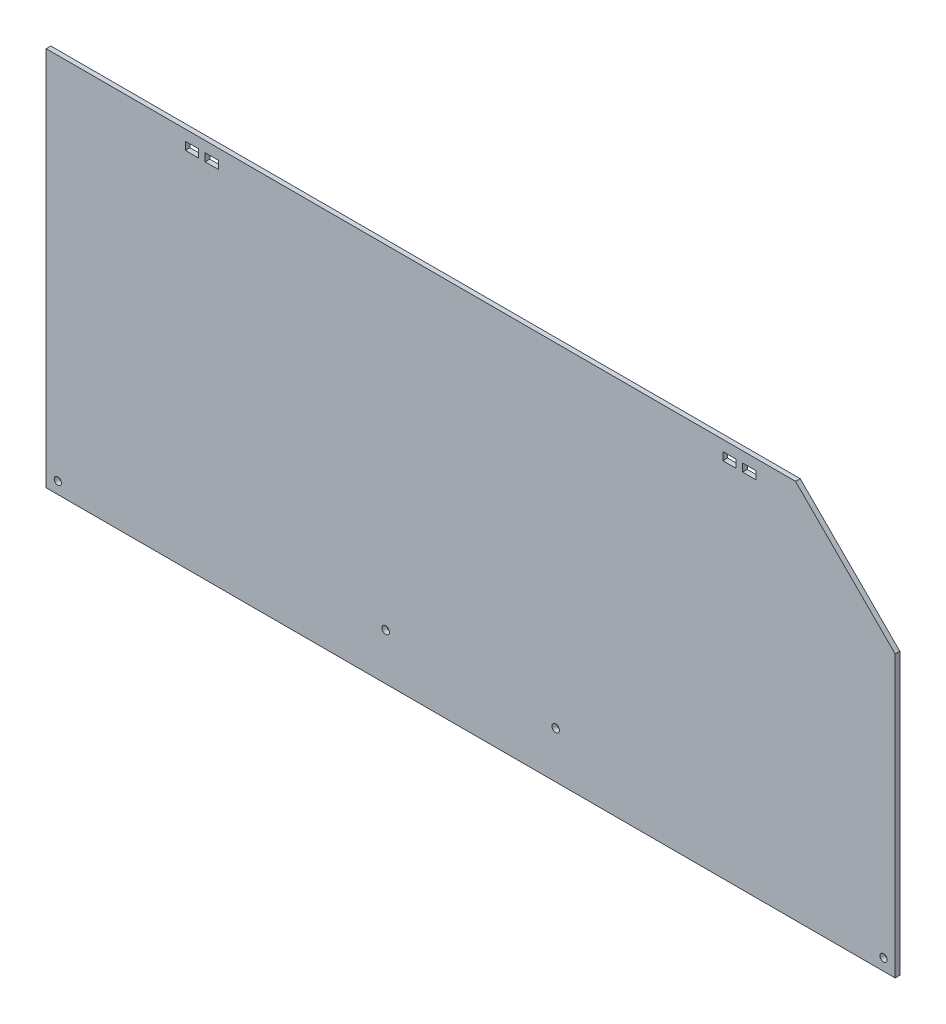
ISO-10303-21;
HEADER;
FILE_DESCRIPTION(('STEP AP214'),'2;1');
FILE_NAME('part.step','',(''),(''),'','','');
FILE_SCHEMA(('AUTOMOTIVE_DESIGN { 1 0 10303 214 1 1 1 1 }'));
ENDSEC;
DATA;
#1=APPLICATION_CONTEXT('core data for automotive mechanical design processes');
#2=APPLICATION_PROTOCOL_DEFINITION('international standard','automotive_design',2000,#1);
#3=PRODUCT_CONTEXT('',#1,'mechanical');
#4=PRODUCT('Part','Part','',(#3));
#5=PRODUCT_RELATED_PRODUCT_CATEGORY('part','',(#4));
#6=PRODUCT_DEFINITION_FORMATION('','',#4);
#7=PRODUCT_DEFINITION_CONTEXT('part definition',#1,'design');
#8=PRODUCT_DEFINITION('design','',#6,#7);
#9=PRODUCT_DEFINITION_SHAPE('','',#8);
#10=(LENGTH_UNIT() NAMED_UNIT(*) SI_UNIT(.MILLI.,.METRE.));
#11=(NAMED_UNIT(*) PLANE_ANGLE_UNIT() SI_UNIT($,.RADIAN.));
#12=(NAMED_UNIT(*) SI_UNIT($,.STERADIAN.) SOLID_ANGLE_UNIT());
#13=UNCERTAINTY_MEASURE_WITH_UNIT(LENGTH_MEASURE(1.E-05),#10,'distance_accuracy_value','');
#14=(GEOMETRIC_REPRESENTATION_CONTEXT(3) GLOBAL_UNCERTAINTY_ASSIGNED_CONTEXT((#13)) GLOBAL_UNIT_ASSIGNED_CONTEXT((#10,
#11,#12)) REPRESENTATION_CONTEXT('',''));
#15=CARTESIAN_POINT('',(0.,0.,0.));
#16=DIRECTION('',(0.,0.,1.));
#17=DIRECTION('',(1.,0.,0.));
#18=AXIS2_PLACEMENT_3D('',#15,#16,#17);
#19=CARTESIAN_POINT('',(-669.5,-329.5,4.));
#20=DIRECTION('',(1.,0.,0.));
#21=DIRECTION('',(0.,0.,-1.));
#22=AXIS2_PLACEMENT_3D('',#19,#20,#21);
#23=PLANE('',#22);
#24=DIRECTION('',(0.,1.,0.));
#25=VECTOR('',#24,1.);
#26=CARTESIAN_POINT('',(-669.5,-329.5,0.));
#27=LINE('',#26,#25);
#28=CARTESIAN_POINT('',(-669.5,-329.5,0.));
#29=VERTEX_POINT('',#28);
#30=CARTESIAN_POINT('',(-669.5,-2.94999999999981,0.));
#31=VERTEX_POINT('',#30);
#32=EDGE_CURVE('E234',#29,#31,#27,.T.);
#33=ORIENTED_EDGE('',*,*,#32,.F.);
#34=DIRECTION('',(0.,0.,-1.));
#35=VECTOR('',#34,1.);
#36=CARTESIAN_POINT('',(-669.5,-329.5,4.));
#37=LINE('',#36,#35);
#38=CARTESIAN_POINT('',(-669.5,-329.5,4.));
#39=VERTEX_POINT('',#38);
#40=EDGE_CURVE('E389',#39,#29,#37,.T.);
#41=ORIENTED_EDGE('',*,*,#40,.F.);
#42=DIRECTION('',(0.,1.,0.));
#43=VECTOR('',#42,1.);
#44=CARTESIAN_POINT('',(-669.5,-329.5,4.));
#45=LINE('',#44,#43);
#46=CARTESIAN_POINT('',(-669.5,-2.94999999999981,4.));
#47=VERTEX_POINT('',#46);
#48=EDGE_CURVE('E369',#39,#47,#45,.T.);
#49=ORIENTED_EDGE('',*,*,#48,.T.);
#50=DIRECTION('',(0.,0.,-1.));
#51=VECTOR('',#50,1.);
#52=CARTESIAN_POINT('',(-669.5,-2.94999999999981,4.));
#53=LINE('',#52,#51);
#54=EDGE_CURVE('E11',#47,#31,#53,.T.);
#55=ORIENTED_EDGE('',*,*,#54,.T.);
#56=EDGE_LOOP('',(#33,#41,#49,#55));
#57=FACE_BOUND('',#56,.T.);
#58=ADVANCED_FACE('F38',(#57),#23,.F.);
#59=CARTESIAN_POINT('',(-669.5,-2.94999999999981,4.));
#60=DIRECTION('',(0.,-1.,0.));
#61=DIRECTION('',(-1.,0.,0.));
#62=AXIS2_PLACEMENT_3D('',#59,#60,#61);
#63=PLANE('',#62);
#64=DIRECTION('',(1.,0.,0.));
#65=VECTOR('',#64,1.);
#66=CARTESIAN_POINT('',(-669.5,-2.94999999999981,0.));
#67=LINE('',#66,#65);
#68=CARTESIAN_POINT('',(-26.0413780286484,-2.94999999999995,0.));
#69=VERTEX_POINT('',#68);
#70=EDGE_CURVE('E393',#31,#69,#67,.T.);
#71=ORIENTED_EDGE('',*,*,#70,.F.);
#72=ORIENTED_EDGE('',*,*,#54,.F.);
#73=DIRECTION('',(1.,0.,0.));
#74=VECTOR('',#73,1.);
#75=CARTESIAN_POINT('',(-669.5,-2.94999999999981,4.));
#76=LINE('',#75,#74);
#77=CARTESIAN_POINT('',(-26.0413780286484,-2.94999999999995,4.));
#78=VERTEX_POINT('',#77);
#79=EDGE_CURVE('E373',#47,#78,#76,.T.);
#80=ORIENTED_EDGE('',*,*,#79,.T.);
#81=DIRECTION('',(0.,0.,-1.));
#82=VECTOR('',#81,1.);
#83=CARTESIAN_POINT('',(-26.0413780286484,-2.94999999999995,4.));
#84=LINE('',#83,#82);
#85=EDGE_CURVE('E46',#78,#69,#84,.T.);
#86=ORIENTED_EDGE('',*,*,#85,.T.);
#87=EDGE_LOOP('',(#71,#72,#80,#86));
#88=FACE_BOUND('',#87,.T.);
#89=ADVANCED_FACE('F421',(#88),#63,.F.);
#90=CARTESIAN_POINT('',(59.4999999999999,-88.4913780286477,4.));
#91=DIRECTION('',(-0.707106781186545,-0.70710678118655,0.));
#92=DIRECTION('',(-0.70710678118655,0.707106781186545,0.));
#93=AXIS2_PLACEMENT_3D('',#90,#91,#92);
#94=PLANE('',#93);
#95=DIRECTION('',(0.70710678118655,-0.707106781186545,0.));
#96=VECTOR('',#95,1.);
#97=CARTESIAN_POINT('',(59.4999999999999,-88.4913780286477,0.));
#98=LINE('',#97,#96);
#99=CARTESIAN_POINT('',(59.4999999999999,-88.4913780286477,0.));
#100=VERTEX_POINT('',#99);
#101=EDGE_CURVE('E397',#69,#100,#98,.T.);
#102=ORIENTED_EDGE('',*,*,#101,.F.);
#103=ORIENTED_EDGE('',*,*,#85,.F.);
#104=DIRECTION('',(0.70710678118655,-0.707106781186545,0.));
#105=VECTOR('',#104,1.);
#106=CARTESIAN_POINT('',(59.4999999999999,-88.4913780286477,4.));
#107=LINE('',#106,#105);
#108=CARTESIAN_POINT('',(59.4999999999999,-88.4913780286477,4.));
#109=VERTEX_POINT('',#108);
#110=EDGE_CURVE('E378',#78,#109,#107,.T.);
#111=ORIENTED_EDGE('',*,*,#110,.T.);
#112=DIRECTION('',(0.,0.,-1.));
#113=VECTOR('',#112,1.);
#114=CARTESIAN_POINT('',(59.4999999999999,-88.4913780286477,4.));
#115=LINE('',#114,#113);
#116=EDGE_CURVE('E414',#109,#100,#115,.T.);
#117=ORIENTED_EDGE('',*,*,#116,.T.);
#118=EDGE_LOOP('',(#102,#103,#111,#117));
#119=FACE_BOUND('',#118,.T.);
#120=ADVANCED_FACE('F433',(#119),#94,.F.);
#121=CARTESIAN_POINT('',(59.4999999999996,-329.5,4.));
#122=DIRECTION('',(-1.,0.,0.));
#123=DIRECTION('',(0.,1.,0.));
#124=AXIS2_PLACEMENT_3D('',#121,#122,#123);
#125=PLANE('',#124);
#126=DIRECTION('',(0.,-1.,0.));
#127=VECTOR('',#126,1.);
#128=CARTESIAN_POINT('',(59.4999999999996,-329.5,0.));
#129=LINE('',#128,#127);
#130=CARTESIAN_POINT('',(59.4999999999996,-329.5,0.));
#131=VERTEX_POINT('',#130);
#132=EDGE_CURVE('E401',#100,#131,#129,.T.);
#133=ORIENTED_EDGE('',*,*,#132,.F.);
#134=ORIENTED_EDGE('',*,*,#116,.F.);
#135=DIRECTION('',(0.,-1.,0.));
#136=VECTOR('',#135,1.);
#137=CARTESIAN_POINT('',(59.4999999999996,-329.5,4.));
#138=LINE('',#137,#136);
#139=CARTESIAN_POINT('',(59.4999999999996,-329.5,4.));
#140=VERTEX_POINT('',#139);
#141=EDGE_CURVE('E382',#109,#140,#138,.T.);
#142=ORIENTED_EDGE('',*,*,#141,.T.);
#143=DIRECTION('',(0.,0.,-1.));
#144=VECTOR('',#143,1.);
#145=CARTESIAN_POINT('',(59.4999999999996,-329.5,4.));
#146=LINE('',#145,#144);
#147=EDGE_CURVE('E410',#140,#131,#146,.T.);
#148=ORIENTED_EDGE('',*,*,#147,.T.);
#149=EDGE_LOOP('',(#133,#134,#142,#148));
#150=FACE_BOUND('',#149,.T.);
#151=ADVANCED_FACE('F435',(#150),#125,.F.);
#152=CARTESIAN_POINT('',(-669.5,-329.5,4.));
#153=DIRECTION('',(0.,1.,0.));
#154=DIRECTION('',(0.,0.,-1.));
#155=AXIS2_PLACEMENT_3D('',#152,#153,#154);
#156=PLANE('',#155);
#157=DIRECTION('',(-1.,0.,0.));
#158=VECTOR('',#157,1.);
#159=CARTESIAN_POINT('',(-669.5,-329.5,0.));
#160=LINE('',#159,#158);
#161=EDGE_CURVE('E374',#131,#29,#160,.T.);
#162=ORIENTED_EDGE('',*,*,#161,.F.);
#163=ORIENTED_EDGE('',*,*,#147,.F.);
#164=DIRECTION('',(-1.,0.,0.));
#165=VECTOR('',#164,1.);
#166=CARTESIAN_POINT('',(-669.5,-329.5,4.));
#167=LINE('',#166,#165);
#168=EDGE_CURVE('E386',#140,#39,#167,.T.);
#169=ORIENTED_EDGE('',*,*,#168,.T.);
#170=ORIENTED_EDGE('',*,*,#40,.T.);
#171=EDGE_LOOP('',(#162,#163,#169,#170));
#172=FACE_BOUND('',#171,.T.);
#173=ADVANCED_FACE('F437',(#172),#156,.F.);
#174=CARTESIAN_POINT('',(0.,0.,4.));
#175=DIRECTION('',(0.,0.,1.));
#176=DIRECTION('',(1.,0.,0.));
#177=AXIS2_PLACEMENT_3D('',#174,#175,#176);
#178=PLANE('',#177);
#179=CARTESIAN_POINT('',(49.4999999999999,-319.5,4.));
#180=DIRECTION('',(0.,0.,1.));
#181=DIRECTION('',(-1.,0.,0.));
#182=AXIS2_PLACEMENT_3D('',#179,#180,#181);
#183=CIRCLE('',#182,3.09999999999999);
#184=CARTESIAN_POINT('',(46.3999999999999,-319.5,4.));
#185=VERTEX_POINT('',#184);
#186=EDGE_CURVE('E681',#185,#185,#183,.T.);
#187=ORIENTED_EDGE('',*,*,#186,.F.);
#188=EDGE_LOOP('',(#187));
#189=FACE_BOUND('',#188,.T.);
#190=CARTESIAN_POINT('',(-659.5,-319.5,4.));
#191=DIRECTION('',(0.,0.,1.));
#192=DIRECTION('',(-1.,0.,0.));
#193=AXIS2_PLACEMENT_3D('',#190,#191,#192);
#194=CIRCLE('',#193,3.09999999999999);
#195=CARTESIAN_POINT('',(-662.6,-319.5,4.));
#196=VERTEX_POINT('',#195);
#197=EDGE_CURVE('E686',#196,#196,#194,.T.);
#198=ORIENTED_EDGE('',*,*,#197,.F.);
#199=EDGE_LOOP('',(#198));
#200=FACE_BOUND('',#199,.T.);
#201=CARTESIAN_POINT('',(-232.,-289.5,4.));
#202=DIRECTION('',(0.,0.,1.));
#203=DIRECTION('',(-1.,0.,0.));
#204=AXIS2_PLACEMENT_3D('',#201,#202,#203);
#205=CIRCLE('',#204,3.25000000000001);
#206=CARTESIAN_POINT('',(-235.25,-289.5,4.));
#207=VERTEX_POINT('',#206);
#208=EDGE_CURVE('E348',#207,#207,#205,.T.);
#209=ORIENTED_EDGE('',*,*,#208,.F.);
#210=EDGE_LOOP('',(#209));
#211=FACE_BOUND('',#210,.T.);
#212=CARTESIAN_POINT('',(-378.,-289.5,4.));
#213=DIRECTION('',(0.,0.,1.));
#214=DIRECTION('',(-1.,0.,0.));
#215=AXIS2_PLACEMENT_3D('',#212,#213,#214);
#216=CIRCLE('',#215,3.25000000000001);
#217=CARTESIAN_POINT('',(-381.25,-289.5,4.));
#218=VERTEX_POINT('',#217);
#219=EDGE_CURVE('E704',#218,#218,#216,.T.);
#220=ORIENTED_EDGE('',*,*,#219,.F.);
#221=EDGE_LOOP('',(#220));
#222=FACE_BOUND('',#221,.T.);
#223=DIRECTION('',(1.,0.,0.));
#224=VECTOR('',#223,1.);
#225=CARTESIAN_POINT('',(-550.,-18.82,4.));
#226=LINE('',#225,#224);
#227=CARTESIAN_POINT('',(-550.,-18.82,4.));
#228=VERTEX_POINT('',#227);
#229=CARTESIAN_POINT('',(-538.5,-18.82,4.));
#230=VERTEX_POINT('',#229);
#231=EDGE_CURVE('E201',#228,#230,#226,.T.);
#232=ORIENTED_EDGE('',*,*,#231,.F.);
#233=DIRECTION('',(0.,-1.,0.));
#234=VECTOR('',#233,1.);
#235=CARTESIAN_POINT('',(-550.,-12.0199999999999,4.));
#236=LINE('',#235,#234);
#237=CARTESIAN_POINT('',(-550.,-12.0199999999999,4.));
#238=VERTEX_POINT('',#237);
#239=EDGE_CURVE('E194',#238,#228,#236,.T.);
#240=ORIENTED_EDGE('',*,*,#239,.F.);
#241=DIRECTION('',(-1.,0.,0.));
#242=VECTOR('',#241,1.);
#243=CARTESIAN_POINT('',(-550.,-12.0199999999999,4.));
#244=LINE('',#243,#242);
#245=CARTESIAN_POINT('',(-538.5,-12.0199999999999,4.));
#246=VERTEX_POINT('',#245);
#247=EDGE_CURVE('E202',#246,#238,#244,.T.);
#248=ORIENTED_EDGE('',*,*,#247,.F.);
#249=DIRECTION('',(0.,1.,0.));
#250=VECTOR('',#249,1.);
#251=CARTESIAN_POINT('',(-538.5,-12.0199999999999,4.));
#252=LINE('',#251,#250);
#253=EDGE_CURVE('E185',#230,#246,#252,.T.);
#254=ORIENTED_EDGE('',*,*,#253,.F.);
#255=EDGE_LOOP('',(#232,#240,#248,#254));
#256=FACE_BOUND('',#255,.T.);
#257=DIRECTION('',(-1.,0.,0.));
#258=VECTOR('',#257,1.);
#259=CARTESIAN_POINT('',(-60.0000000000001,-12.0199999999998,4.));
#260=LINE('',#259,#258);
#261=CARTESIAN_POINT('',(-60.0000000000001,-12.0199999999998,4.));
#262=VERTEX_POINT('',#261);
#263=CARTESIAN_POINT('',(-71.5000000000001,-12.0199999999998,4.));
#264=VERTEX_POINT('',#263);
#265=EDGE_CURVE('E240',#262,#264,#260,.T.);
#266=ORIENTED_EDGE('',*,*,#265,.F.);
#267=DIRECTION('',(0.,1.,0.));
#268=VECTOR('',#267,1.);
#269=CARTESIAN_POINT('',(-60.0000000000001,-12.0199999999998,4.));
#270=LINE('',#269,#268);
#271=CARTESIAN_POINT('',(-60.0000000000001,-18.82,4.));
#272=VERTEX_POINT('',#271);
#273=EDGE_CURVE('E251',#272,#262,#270,.T.);
#274=ORIENTED_EDGE('',*,*,#273,.F.);
#275=DIRECTION('',(1.,0.,0.));
#276=VECTOR('',#275,1.);
#277=CARTESIAN_POINT('',(-60.0000000000001,-18.82,4.));
#278=LINE('',#277,#276);
#279=CARTESIAN_POINT('',(-71.5000000000001,-18.82,4.));
#280=VERTEX_POINT('',#279);
#281=EDGE_CURVE('E248',#280,#272,#278,.T.);
#282=ORIENTED_EDGE('',*,*,#281,.F.);
#283=DIRECTION('',(0.,-1.,0.));
#284=VECTOR('',#283,1.);
#285=CARTESIAN_POINT('',(-71.5000000000001,-12.0199999999998,4.));
#286=LINE('',#285,#284);
#287=EDGE_CURVE('E244',#264,#280,#286,.T.);
#288=ORIENTED_EDGE('',*,*,#287,.F.);
#289=EDGE_LOOP('',(#266,#274,#282,#288));
#290=FACE_BOUND('',#289,.T.);
#291=DIRECTION('',(-1.,0.,0.));
#292=VECTOR('',#291,1.);
#293=CARTESIAN_POINT('',(-77.0000000000001,-12.0199999999998,4.));
#294=LINE('',#293,#292);
#295=CARTESIAN_POINT('',(-77.0000000000001,-12.0199999999998,4.));
#296=VERTEX_POINT('',#295);
#297=CARTESIAN_POINT('',(-88.5000000000001,-12.0199999999998,4.));
#298=VERTEX_POINT('',#297);
#299=EDGE_CURVE('E281',#296,#298,#294,.T.);
#300=ORIENTED_EDGE('',*,*,#299,.F.);
#301=DIRECTION('',(0.,1.,0.));
#302=VECTOR('',#301,1.);
#303=CARTESIAN_POINT('',(-77.0000000000001,-12.0199999999998,4.));
#304=LINE('',#303,#302);
#305=CARTESIAN_POINT('',(-77.0000000000001,-18.82,4.));
#306=VERTEX_POINT('',#305);
#307=EDGE_CURVE('E294',#306,#296,#304,.T.);
#308=ORIENTED_EDGE('',*,*,#307,.F.);
#309=DIRECTION('',(1.,0.,0.));
#310=VECTOR('',#309,1.);
#311=CARTESIAN_POINT('',(-77.0000000000001,-18.82,4.));
#312=LINE('',#311,#310);
#313=CARTESIAN_POINT('',(-88.5000000000001,-18.82,4.));
#314=VERTEX_POINT('',#313);
#315=EDGE_CURVE('E290',#314,#306,#312,.T.);
#316=ORIENTED_EDGE('',*,*,#315,.F.);
#317=DIRECTION('',(0.,-1.,0.));
#318=VECTOR('',#317,1.);
#319=CARTESIAN_POINT('',(-88.5000000000001,-12.0199999999998,4.));
#320=LINE('',#319,#318);
#321=EDGE_CURVE('E285',#298,#314,#320,.T.);
#322=ORIENTED_EDGE('',*,*,#321,.F.);
#323=EDGE_LOOP('',(#300,#308,#316,#322));
#324=FACE_BOUND('',#323,.T.);
#325=DIRECTION('',(0.,1.,0.));
#326=VECTOR('',#325,1.);
#327=CARTESIAN_POINT('',(-521.5,-12.0199999999999,4.));
#328=LINE('',#327,#326);
#329=CARTESIAN_POINT('',(-521.5,-18.82,4.));
#330=VERTEX_POINT('',#329);
#331=CARTESIAN_POINT('',(-521.5,-12.0199999999999,4.));
#332=VERTEX_POINT('',#331);
#333=EDGE_CURVE('E325',#330,#332,#328,.T.);
#334=ORIENTED_EDGE('',*,*,#333,.F.);
#335=DIRECTION('',(1.,0.,0.));
#336=VECTOR('',#335,1.);
#337=CARTESIAN_POINT('',(-533.,-18.82,4.));
#338=LINE('',#337,#336);
#339=CARTESIAN_POINT('',(-533.,-18.82,4.));
#340=VERTEX_POINT('',#339);
#341=EDGE_CURVE('E338',#340,#330,#338,.T.);
#342=ORIENTED_EDGE('',*,*,#341,.F.);
#343=DIRECTION('',(0.,-1.,0.));
#344=VECTOR('',#343,1.);
#345=CARTESIAN_POINT('',(-533.,-12.0199999999999,4.));
#346=LINE('',#345,#344);
#347=CARTESIAN_POINT('',(-533.,-12.0199999999999,4.));
#348=VERTEX_POINT('',#347);
#349=EDGE_CURVE('E334',#348,#340,#346,.T.);
#350=ORIENTED_EDGE('',*,*,#349,.F.);
#351=DIRECTION('',(-1.,0.,0.));
#352=VECTOR('',#351,1.);
#353=CARTESIAN_POINT('',(-533.,-12.0199999999999,4.));
#354=LINE('',#353,#352);
#355=EDGE_CURVE('E329',#332,#348,#354,.T.);
#356=ORIENTED_EDGE('',*,*,#355,.F.);
#357=EDGE_LOOP('',(#334,#342,#350,#356));
#358=FACE_BOUND('',#357,.T.);
#359=ORIENTED_EDGE('',*,*,#48,.F.);
#360=ORIENTED_EDGE('',*,*,#168,.F.);
#361=ORIENTED_EDGE('',*,*,#141,.F.);
#362=ORIENTED_EDGE('',*,*,#110,.F.);
#363=ORIENTED_EDGE('',*,*,#79,.F.);
#364=EDGE_LOOP('',(#359,#360,#361,#362,#363));
#365=FACE_BOUND('',#364,.T.);
#366=ADVANCED_FACE('F198',(#189,#200,#211,#222,#256,#290,#324,#358,#365),#178,.T.);
#367=CARTESIAN_POINT('',(0.,0.,0.));
#368=DIRECTION('',(0.,0.,1.));
#369=DIRECTION('',(1.,0.,0.));
#370=AXIS2_PLACEMENT_3D('',#367,#368,#369);
#371=PLANE('',#370);
#372=CARTESIAN_POINT('',(49.4999999999999,-319.5,0.));
#373=DIRECTION('',(0.,0.,1.));
#374=DIRECTION('',(-1.,0.,0.));
#375=AXIS2_PLACEMENT_3D('',#372,#373,#374);
#376=CIRCLE('',#375,3.09999999999999);
#377=CARTESIAN_POINT('',(46.3999999999999,-319.5,0.));
#378=VERTEX_POINT('',#377);
#379=EDGE_CURVE('E684',#378,#378,#376,.T.);
#380=ORIENTED_EDGE('',*,*,#379,.T.);
#381=EDGE_LOOP('',(#380));
#382=FACE_BOUND('',#381,.T.);
#383=CARTESIAN_POINT('',(-659.5,-319.5,0.));
#384=DIRECTION('',(0.,0.,1.));
#385=DIRECTION('',(-1.,0.,0.));
#386=AXIS2_PLACEMENT_3D('',#383,#384,#385);
#387=CIRCLE('',#386,3.09999999999999);
#388=CARTESIAN_POINT('',(-662.6,-319.5,0.));
#389=VERTEX_POINT('',#388);
#390=EDGE_CURVE('E692',#389,#389,#387,.T.);
#391=ORIENTED_EDGE('',*,*,#390,.T.);
#392=EDGE_LOOP('',(#391));
#393=FACE_BOUND('',#392,.T.);
#394=CARTESIAN_POINT('',(-232.,-289.5,0.));
#395=DIRECTION('',(0.,0.,1.));
#396=DIRECTION('',(-1.,0.,0.));
#397=AXIS2_PLACEMENT_3D('',#394,#395,#396);
#398=CIRCLE('',#397,3.25000000000001);
#399=CARTESIAN_POINT('',(-235.25,-289.5,0.));
#400=VERTEX_POINT('',#399);
#401=EDGE_CURVE('E701',#400,#400,#398,.T.);
#402=ORIENTED_EDGE('',*,*,#401,.T.);
#403=EDGE_LOOP('',(#402));
#404=FACE_BOUND('',#403,.T.);
#405=CARTESIAN_POINT('',(-378.,-289.5,0.));
#406=DIRECTION('',(0.,0.,1.));
#407=DIRECTION('',(-1.,0.,0.));
#408=AXIS2_PLACEMENT_3D('',#405,#406,#407);
#409=CIRCLE('',#408,3.25000000000001);
#410=CARTESIAN_POINT('',(-381.25,-289.5,0.));
#411=VERTEX_POINT('',#410);
#412=EDGE_CURVE('E216',#411,#411,#409,.T.);
#413=ORIENTED_EDGE('',*,*,#412,.T.);
#414=EDGE_LOOP('',(#413));
#415=FACE_BOUND('',#414,.T.);
#416=DIRECTION('',(0.,1.,0.));
#417=VECTOR('',#416,1.);
#418=CARTESIAN_POINT('',(-538.5,-12.0199999999999,0.));
#419=LINE('',#418,#417);
#420=CARTESIAN_POINT('',(-538.5,-18.82,0.));
#421=VERTEX_POINT('',#420);
#422=CARTESIAN_POINT('',(-538.5,-12.0199999999999,0.));
#423=VERTEX_POINT('',#422);
#424=EDGE_CURVE('E188',#421,#423,#419,.T.);
#425=ORIENTED_EDGE('',*,*,#424,.T.);
#426=DIRECTION('',(-1.,0.,0.));
#427=VECTOR('',#426,1.);
#428=CARTESIAN_POINT('',(-550.,-12.0199999999999,0.));
#429=LINE('',#428,#427);
#430=CARTESIAN_POINT('',(-550.,-12.0199999999999,0.));
#431=VERTEX_POINT('',#430);
#432=EDGE_CURVE('E213',#423,#431,#429,.T.);
#433=ORIENTED_EDGE('',*,*,#432,.T.);
#434=DIRECTION('',(0.,-1.,0.));
#435=VECTOR('',#434,1.);
#436=CARTESIAN_POINT('',(-550.,-12.0199999999999,0.));
#437=LINE('',#436,#435);
#438=CARTESIAN_POINT('',(-550.,-18.82,0.));
#439=VERTEX_POINT('',#438);
#440=EDGE_CURVE('E209',#431,#439,#437,.T.);
#441=ORIENTED_EDGE('',*,*,#440,.T.);
#442=DIRECTION('',(1.,0.,0.));
#443=VECTOR('',#442,1.);
#444=CARTESIAN_POINT('',(-550.,-18.82,0.));
#445=LINE('',#444,#443);
#446=EDGE_CURVE('E223',#439,#421,#445,.T.);
#447=ORIENTED_EDGE('',*,*,#446,.T.);
#448=EDGE_LOOP('',(#425,#433,#441,#447));
#449=FACE_BOUND('',#448,.T.);
#450=DIRECTION('',(0.,-1.,0.));
#451=VECTOR('',#450,1.);
#452=CARTESIAN_POINT('',(-71.5000000000001,-12.0199999999998,0.));
#453=LINE('',#452,#451);
#454=CARTESIAN_POINT('',(-71.5000000000001,-12.0199999999998,0.));
#455=VERTEX_POINT('',#454);
#456=CARTESIAN_POINT('',(-71.5000000000001,-18.82,0.));
#457=VERTEX_POINT('',#456);
#458=EDGE_CURVE('E260',#455,#457,#453,.T.);
#459=ORIENTED_EDGE('',*,*,#458,.T.);
#460=DIRECTION('',(1.,0.,0.));
#461=VECTOR('',#460,1.);
#462=CARTESIAN_POINT('',(-60.0000000000001,-18.82,0.));
#463=LINE('',#462,#461);
#464=CARTESIAN_POINT('',(-60.0000000000001,-18.82,0.));
#465=VERTEX_POINT('',#464);
#466=EDGE_CURVE('E265',#457,#465,#463,.T.);
#467=ORIENTED_EDGE('',*,*,#466,.T.);
#468=DIRECTION('',(0.,1.,0.));
#469=VECTOR('',#468,1.);
#470=CARTESIAN_POINT('',(-60.0000000000001,-12.0199999999998,0.));
#471=LINE('',#470,#469);
#472=CARTESIAN_POINT('',(-60.0000000000001,-12.0199999999998,0.));
#473=VERTEX_POINT('',#472);
#474=EDGE_CURVE('E245',#465,#473,#471,.T.);
#475=ORIENTED_EDGE('',*,*,#474,.T.);
#476=DIRECTION('',(-1.,0.,0.));
#477=VECTOR('',#476,1.);
#478=CARTESIAN_POINT('',(-60.0000000000001,-12.0199999999998,0.));
#479=LINE('',#478,#477);
#480=EDGE_CURVE('E256',#473,#455,#479,.T.);
#481=ORIENTED_EDGE('',*,*,#480,.T.);
#482=EDGE_LOOP('',(#459,#467,#475,#481));
#483=FACE_BOUND('',#482,.T.);
#484=DIRECTION('',(0.,-1.,0.));
#485=VECTOR('',#484,1.);
#486=CARTESIAN_POINT('',(-88.5000000000001,-12.0199999999998,0.));
#487=LINE('',#486,#485);
#488=CARTESIAN_POINT('',(-88.5000000000001,-12.0199999999998,0.));
#489=VERTEX_POINT('',#488);
#490=CARTESIAN_POINT('',(-88.5000000000001,-18.82,0.));
#491=VERTEX_POINT('',#490);
#492=EDGE_CURVE('E303',#489,#491,#487,.T.);
#493=ORIENTED_EDGE('',*,*,#492,.T.);
#494=DIRECTION('',(1.,0.,0.));
#495=VECTOR('',#494,1.);
#496=CARTESIAN_POINT('',(-77.0000000000001,-18.82,0.));
#497=LINE('',#496,#495);
#498=CARTESIAN_POINT('',(-77.0000000000001,-18.82,0.));
#499=VERTEX_POINT('',#498);
#500=EDGE_CURVE('E308',#491,#499,#497,.T.);
#501=ORIENTED_EDGE('',*,*,#500,.T.);
#502=DIRECTION('',(0.,1.,0.));
#503=VECTOR('',#502,1.);
#504=CARTESIAN_POINT('',(-77.0000000000001,-12.0199999999998,0.));
#505=LINE('',#504,#503);
#506=CARTESIAN_POINT('',(-77.0000000000001,-12.0199999999998,0.));
#507=VERTEX_POINT('',#506);
#508=EDGE_CURVE('E286',#499,#507,#505,.T.);
#509=ORIENTED_EDGE('',*,*,#508,.T.);
#510=DIRECTION('',(-1.,0.,0.));
#511=VECTOR('',#510,1.);
#512=CARTESIAN_POINT('',(-77.0000000000001,-12.0199999999998,0.));
#513=LINE('',#512,#511);
#514=EDGE_CURVE('E299',#507,#489,#513,.T.);
#515=ORIENTED_EDGE('',*,*,#514,.T.);
#516=EDGE_LOOP('',(#493,#501,#509,#515));
#517=FACE_BOUND('',#516,.T.);
#518=DIRECTION('',(-1.,0.,0.));
#519=VECTOR('',#518,1.);
#520=CARTESIAN_POINT('',(-533.,-12.0199999999999,0.));
#521=LINE('',#520,#519);
#522=CARTESIAN_POINT('',(-521.5,-12.0199999999999,0.));
#523=VERTEX_POINT('',#522);
#524=CARTESIAN_POINT('',(-533.,-12.0199999999999,0.));
#525=VERTEX_POINT('',#524);
#526=EDGE_CURVE('E347',#523,#525,#521,.T.);
#527=ORIENTED_EDGE('',*,*,#526,.T.);
#528=DIRECTION('',(0.,-1.,0.));
#529=VECTOR('',#528,1.);
#530=CARTESIAN_POINT('',(-533.,-12.0199999999999,0.));
#531=LINE('',#530,#529);
#532=CARTESIAN_POINT('',(-533.,-18.82,0.));
#533=VERTEX_POINT('',#532);
#534=EDGE_CURVE('E352',#525,#533,#531,.T.);
#535=ORIENTED_EDGE('',*,*,#534,.T.);
#536=DIRECTION('',(1.,0.,0.));
#537=VECTOR('',#536,1.);
#538=CARTESIAN_POINT('',(-533.,-18.82,0.));
#539=LINE('',#538,#537);
#540=CARTESIAN_POINT('',(-521.5,-18.82,0.));
#541=VERTEX_POINT('',#540);
#542=EDGE_CURVE('E330',#533,#541,#539,.T.);
#543=ORIENTED_EDGE('',*,*,#542,.T.);
#544=DIRECTION('',(0.,1.,0.));
#545=VECTOR('',#544,1.);
#546=CARTESIAN_POINT('',(-521.5,-12.0199999999999,0.));
#547=LINE('',#546,#545);
#548=EDGE_CURVE('E343',#541,#523,#547,.T.);
#549=ORIENTED_EDGE('',*,*,#548,.T.);
#550=EDGE_LOOP('',(#527,#535,#543,#549));
#551=FACE_BOUND('',#550,.T.);
#552=ORIENTED_EDGE('',*,*,#32,.T.);
#553=ORIENTED_EDGE('',*,*,#70,.T.);
#554=ORIENTED_EDGE('',*,*,#101,.T.);
#555=ORIENTED_EDGE('',*,*,#132,.T.);
#556=ORIENTED_EDGE('',*,*,#161,.T.);
#557=EDGE_LOOP('',(#552,#553,#554,#555,#556));
#558=FACE_BOUND('',#557,.T.);
#559=ADVANCED_FACE('F425',(#382,#393,#404,#415,#449,#483,#517,#551,#558),#371,.F.);
#560=CARTESIAN_POINT('',(-521.5,-12.0199999999999,4.));
#561=DIRECTION('',(1.,0.,0.));
#562=DIRECTION('',(0.,0.,-1.));
#563=AXIS2_PLACEMENT_3D('',#560,#561,#562);
#564=PLANE('',#563);
#565=ORIENTED_EDGE('',*,*,#548,.F.);
#566=DIRECTION('',(0.,0.,-1.));
#567=VECTOR('',#566,1.);
#568=CARTESIAN_POINT('',(-521.5,-18.82,4.));
#569=LINE('',#568,#567);
#570=EDGE_CURVE('E304',#330,#541,#569,.T.);
#571=ORIENTED_EDGE('',*,*,#570,.F.);
#572=ORIENTED_EDGE('',*,*,#333,.T.);
#573=DIRECTION('',(0.,0.,-1.));
#574=VECTOR('',#573,1.);
#575=CARTESIAN_POINT('',(-521.5,-12.0199999999999,4.));
#576=LINE('',#575,#574);
#577=EDGE_CURVE('E342',#332,#523,#576,.T.);
#578=ORIENTED_EDGE('',*,*,#577,.T.);
#579=EDGE_LOOP('',(#565,#571,#572,#578));
#580=FACE_BOUND('',#579,.T.);
#581=ADVANCED_FACE('F481',(#580),#564,.F.);
#582=CARTESIAN_POINT('',(-533.,-18.82,4.));
#583=DIRECTION('',(0.,-1.,0.));
#584=DIRECTION('',(-1.,0.,0.));
#585=AXIS2_PLACEMENT_3D('',#582,#583,#584);
#586=PLANE('',#585);
#587=ORIENTED_EDGE('',*,*,#542,.F.);
#588=DIRECTION('',(0.,0.,-1.));
#589=VECTOR('',#588,1.);
#590=CARTESIAN_POINT('',(-533.,-18.82,4.));
#591=LINE('',#590,#589);
#592=EDGE_CURVE('E361',#340,#533,#591,.T.);
#593=ORIENTED_EDGE('',*,*,#592,.F.);
#594=ORIENTED_EDGE('',*,*,#341,.T.);
#595=ORIENTED_EDGE('',*,*,#570,.T.);
#596=EDGE_LOOP('',(#587,#593,#594,#595));
#597=FACE_BOUND('',#596,.T.);
#598=ADVANCED_FACE('F490',(#597),#586,.F.);
#599=CARTESIAN_POINT('',(-533.,-12.0199999999999,4.));
#600=DIRECTION('',(-1.,0.,0.));
#601=DIRECTION('',(0.,0.,1.));
#602=AXIS2_PLACEMENT_3D('',#599,#600,#601);
#603=PLANE('',#602);
#604=ORIENTED_EDGE('',*,*,#534,.F.);
#605=DIRECTION('',(0.,0.,-1.));
#606=VECTOR('',#605,1.);
#607=CARTESIAN_POINT('',(-533.,-12.0199999999999,4.));
#608=LINE('',#607,#606);
#609=EDGE_CURVE('E364',#348,#525,#608,.T.);
#610=ORIENTED_EDGE('',*,*,#609,.F.);
#611=ORIENTED_EDGE('',*,*,#349,.T.);
#612=ORIENTED_EDGE('',*,*,#592,.T.);
#613=EDGE_LOOP('',(#604,#610,#611,#612));
#614=FACE_BOUND('',#613,.T.);
#615=ADVANCED_FACE('F500',(#614),#603,.F.);
#616=CARTESIAN_POINT('',(-533.,-12.0199999999999,4.));
#617=DIRECTION('',(0.,1.,0.));
#618=DIRECTION('',(1.,0.,0.));
#619=AXIS2_PLACEMENT_3D('',#616,#617,#618);
#620=PLANE('',#619);
#621=ORIENTED_EDGE('',*,*,#526,.F.);
#622=ORIENTED_EDGE('',*,*,#577,.F.);
#623=ORIENTED_EDGE('',*,*,#355,.T.);
#624=ORIENTED_EDGE('',*,*,#609,.T.);
#625=EDGE_LOOP('',(#621,#622,#623,#624));
#626=FACE_BOUND('',#625,.T.);
#627=ADVANCED_FACE('F510',(#626),#620,.F.);
#628=CARTESIAN_POINT('',(-77.0000000000001,-12.0199999999998,4.));
#629=DIRECTION('',(0.,1.,0.));
#630=DIRECTION('',(0.,0.,-1.));
#631=AXIS2_PLACEMENT_3D('',#628,#629,#630);
#632=PLANE('',#631);
#633=ORIENTED_EDGE('',*,*,#514,.F.);
#634=DIRECTION('',(0.,0.,-1.));
#635=VECTOR('',#634,1.);
#636=CARTESIAN_POINT('',(-77.0000000000001,-12.0199999999998,4.));
#637=LINE('',#636,#635);
#638=EDGE_CURVE('E261',#296,#507,#637,.T.);
#639=ORIENTED_EDGE('',*,*,#638,.F.);
#640=ORIENTED_EDGE('',*,*,#299,.T.);
#641=DIRECTION('',(0.,0.,-1.));
#642=VECTOR('',#641,1.);
#643=CARTESIAN_POINT('',(-88.5000000000001,-12.0199999999998,4.));
#644=LINE('',#643,#642);
#645=EDGE_CURVE('E298',#298,#489,#644,.T.);
#646=ORIENTED_EDGE('',*,*,#645,.T.);
#647=EDGE_LOOP('',(#633,#639,#640,#646));
#648=FACE_BOUND('',#647,.T.);
#649=ADVANCED_FACE('F520',(#648),#632,.F.);
#650=CARTESIAN_POINT('',(-77.0000000000001,-12.0199999999998,4.));
#651=DIRECTION('',(1.,0.,0.));
#652=DIRECTION('',(0.,0.,-1.));
#653=AXIS2_PLACEMENT_3D('',#650,#651,#652);
#654=PLANE('',#653);
#655=ORIENTED_EDGE('',*,*,#508,.F.);
#656=DIRECTION('',(0.,0.,-1.));
#657=VECTOR('',#656,1.);
#658=CARTESIAN_POINT('',(-77.0000000000001,-18.82,4.));
#659=LINE('',#658,#657);
#660=EDGE_CURVE('E317',#306,#499,#659,.T.);
#661=ORIENTED_EDGE('',*,*,#660,.F.);
#662=ORIENTED_EDGE('',*,*,#307,.T.);
#663=ORIENTED_EDGE('',*,*,#638,.T.);
#664=EDGE_LOOP('',(#655,#661,#662,#663));
#665=FACE_BOUND('',#664,.T.);
#666=ADVANCED_FACE('F530',(#665),#654,.F.);
#667=CARTESIAN_POINT('',(-77.0000000000001,-18.82,4.));
#668=DIRECTION('',(0.,-1.,0.));
#669=DIRECTION('',(0.,0.,1.));
#670=AXIS2_PLACEMENT_3D('',#667,#668,#669);
#671=PLANE('',#670);
#672=ORIENTED_EDGE('',*,*,#500,.F.);
#673=DIRECTION('',(0.,0.,-1.));
#674=VECTOR('',#673,1.);
#675=CARTESIAN_POINT('',(-88.5000000000001,-18.82,4.));
#676=LINE('',#675,#674);
#677=EDGE_CURVE('E320',#314,#491,#676,.T.);
#678=ORIENTED_EDGE('',*,*,#677,.F.);
#679=ORIENTED_EDGE('',*,*,#315,.T.);
#680=ORIENTED_EDGE('',*,*,#660,.T.);
#681=EDGE_LOOP('',(#672,#678,#679,#680));
#682=FACE_BOUND('',#681,.T.);
#683=ADVANCED_FACE('F540',(#682),#671,.F.);
#684=CARTESIAN_POINT('',(-88.5000000000001,-12.0199999999998,4.));
#685=DIRECTION('',(-1.,0.,0.));
#686=DIRECTION('',(0.,0.,1.));
#687=AXIS2_PLACEMENT_3D('',#684,#685,#686);
#688=PLANE('',#687);
#689=ORIENTED_EDGE('',*,*,#492,.F.);
#690=ORIENTED_EDGE('',*,*,#645,.F.);
#691=ORIENTED_EDGE('',*,*,#321,.T.);
#692=ORIENTED_EDGE('',*,*,#677,.T.);
#693=EDGE_LOOP('',(#689,#690,#691,#692));
#694=FACE_BOUND('',#693,.T.);
#695=ADVANCED_FACE('F550',(#694),#688,.F.);
#696=CARTESIAN_POINT('',(-60.0000000000001,-12.0199999999998,4.));
#697=DIRECTION('',(0.,1.,0.));
#698=DIRECTION('',(0.,0.,-1.));
#699=AXIS2_PLACEMENT_3D('',#696,#697,#698);
#700=PLANE('',#699);
#701=ORIENTED_EDGE('',*,*,#480,.F.);
#702=DIRECTION('',(0.,0.,-1.));
#703=VECTOR('',#702,1.);
#704=CARTESIAN_POINT('',(-60.0000000000001,-12.0199999999998,4.));
#705=LINE('',#704,#703);
#706=EDGE_CURVE('E226',#262,#473,#705,.T.);
#707=ORIENTED_EDGE('',*,*,#706,.F.);
#708=ORIENTED_EDGE('',*,*,#265,.T.);
#709=DIRECTION('',(0.,0.,-1.));
#710=VECTOR('',#709,1.);
#711=CARTESIAN_POINT('',(-71.5000000000001,-12.0199999999998,4.));
#712=LINE('',#711,#710);
#713=EDGE_CURVE('E255',#264,#455,#712,.T.);
#714=ORIENTED_EDGE('',*,*,#713,.T.);
#715=EDGE_LOOP('',(#701,#707,#708,#714));
#716=FACE_BOUND('',#715,.T.);
#717=ADVANCED_FACE('F560',(#716),#700,.F.);
#718=CARTESIAN_POINT('',(-60.0000000000001,-12.0199999999998,4.));
#719=DIRECTION('',(1.,0.,0.));
#720=DIRECTION('',(0.,0.,-1.));
#721=AXIS2_PLACEMENT_3D('',#718,#719,#720);
#722=PLANE('',#721);
#723=ORIENTED_EDGE('',*,*,#474,.F.);
#724=DIRECTION('',(0.,0.,-1.));
#725=VECTOR('',#724,1.);
#726=CARTESIAN_POINT('',(-60.0000000000001,-18.82,4.));
#727=LINE('',#726,#725);
#728=EDGE_CURVE('E274',#272,#465,#727,.T.);
#729=ORIENTED_EDGE('',*,*,#728,.F.);
#730=ORIENTED_EDGE('',*,*,#273,.T.);
#731=ORIENTED_EDGE('',*,*,#706,.T.);
#732=EDGE_LOOP('',(#723,#729,#730,#731));
#733=FACE_BOUND('',#732,.T.);
#734=ADVANCED_FACE('F570',(#733),#722,.F.);
#735=CARTESIAN_POINT('',(-60.0000000000001,-18.82,4.));
#736=DIRECTION('',(0.,-1.,0.));
#737=DIRECTION('',(0.,0.,1.));
#738=AXIS2_PLACEMENT_3D('',#735,#736,#737);
#739=PLANE('',#738);
#740=ORIENTED_EDGE('',*,*,#466,.F.);
#741=DIRECTION('',(0.,0.,-1.));
#742=VECTOR('',#741,1.);
#743=CARTESIAN_POINT('',(-71.5000000000001,-18.82,4.));
#744=LINE('',#743,#742);
#745=EDGE_CURVE('E61',#280,#457,#744,.T.);
#746=ORIENTED_EDGE('',*,*,#745,.F.);
#747=ORIENTED_EDGE('',*,*,#281,.T.);
#748=ORIENTED_EDGE('',*,*,#728,.T.);
#749=EDGE_LOOP('',(#740,#746,#747,#748));
#750=FACE_BOUND('',#749,.T.);
#751=ADVANCED_FACE('F580',(#750),#739,.F.);
#752=CARTESIAN_POINT('',(-71.5000000000001,-12.0199999999998,4.));
#753=DIRECTION('',(-1.,0.,0.));
#754=DIRECTION('',(0.,0.,1.));
#755=AXIS2_PLACEMENT_3D('',#752,#753,#754);
#756=PLANE('',#755);
#757=ORIENTED_EDGE('',*,*,#458,.F.);
#758=ORIENTED_EDGE('',*,*,#713,.F.);
#759=ORIENTED_EDGE('',*,*,#287,.T.);
#760=ORIENTED_EDGE('',*,*,#745,.T.);
#761=EDGE_LOOP('',(#757,#758,#759,#760));
#762=FACE_BOUND('',#761,.T.);
#763=ADVANCED_FACE('F590',(#762),#756,.F.);
#764=CARTESIAN_POINT('',(-550.,-18.82,4.));
#765=DIRECTION('',(0.,-1.,0.));
#766=DIRECTION('',(-1.,0.,0.));
#767=AXIS2_PLACEMENT_3D('',#764,#765,#766);
#768=PLANE('',#767);
#769=ORIENTED_EDGE('',*,*,#446,.F.);
#770=DIRECTION('',(0.,0.,-1.));
#771=VECTOR('',#770,1.);
#772=CARTESIAN_POINT('',(-550.,-18.82,4.));
#773=LINE('',#772,#771);
#774=EDGE_CURVE('E206',#228,#439,#773,.T.);
#775=ORIENTED_EDGE('',*,*,#774,.F.);
#776=ORIENTED_EDGE('',*,*,#231,.T.);
#777=DIRECTION('',(0.,0.,-1.));
#778=VECTOR('',#777,1.);
#779=CARTESIAN_POINT('',(-538.5,-18.82,4.));
#780=LINE('',#779,#778);
#781=EDGE_CURVE('E182',#230,#421,#780,.T.);
#782=ORIENTED_EDGE('',*,*,#781,.T.);
#783=EDGE_LOOP('',(#769,#775,#776,#782));
#784=FACE_BOUND('',#783,.T.);
#785=ADVANCED_FACE('F205',(#784),#768,.F.);
#786=CARTESIAN_POINT('',(-550.,-12.0199999999999,4.));
#787=DIRECTION('',(-1.,0.,0.));
#788=DIRECTION('',(0.,0.,1.));
#789=AXIS2_PLACEMENT_3D('',#786,#787,#788);
#790=PLANE('',#789);
#791=ORIENTED_EDGE('',*,*,#440,.F.);
#792=DIRECTION('',(0.,0.,-1.));
#793=VECTOR('',#792,1.);
#794=CARTESIAN_POINT('',(-550.,-12.0199999999999,4.));
#795=LINE('',#794,#793);
#796=EDGE_CURVE('E235',#238,#431,#795,.T.);
#797=ORIENTED_EDGE('',*,*,#796,.F.);
#798=ORIENTED_EDGE('',*,*,#239,.T.);
#799=ORIENTED_EDGE('',*,*,#774,.T.);
#800=EDGE_LOOP('',(#791,#797,#798,#799));
#801=FACE_BOUND('',#800,.T.);
#802=ADVANCED_FACE('F608',(#801),#790,.F.);
#803=CARTESIAN_POINT('',(-550.,-12.0199999999999,4.));
#804=DIRECTION('',(0.,1.,0.));
#805=DIRECTION('',(1.,0.,0.));
#806=AXIS2_PLACEMENT_3D('',#803,#804,#805);
#807=PLANE('',#806);
#808=ORIENTED_EDGE('',*,*,#432,.F.);
#809=DIRECTION('',(0.,0.,-1.));
#810=VECTOR('',#809,1.);
#811=CARTESIAN_POINT('',(-538.5,-12.0199999999999,4.));
#812=LINE('',#811,#810);
#813=EDGE_CURVE('E53',#246,#423,#812,.T.);
#814=ORIENTED_EDGE('',*,*,#813,.F.);
#815=ORIENTED_EDGE('',*,*,#247,.T.);
#816=ORIENTED_EDGE('',*,*,#796,.T.);
#817=EDGE_LOOP('',(#808,#814,#815,#816));
#818=FACE_BOUND('',#817,.T.);
#819=ADVANCED_FACE('F617',(#818),#807,.F.);
#820=CARTESIAN_POINT('',(-538.5,-12.0199999999999,4.));
#821=DIRECTION('',(1.,0.,0.));
#822=DIRECTION('',(0.,0.,-1.));
#823=AXIS2_PLACEMENT_3D('',#820,#821,#822);
#824=PLANE('',#823);
#825=ORIENTED_EDGE('',*,*,#424,.F.);
#826=ORIENTED_EDGE('',*,*,#781,.F.);
#827=ORIENTED_EDGE('',*,*,#253,.T.);
#828=ORIENTED_EDGE('',*,*,#813,.T.);
#829=EDGE_LOOP('',(#825,#826,#827,#828));
#830=FACE_BOUND('',#829,.T.);
#831=ADVANCED_FACE('F184',(#830),#824,.F.);
#832=CARTESIAN_POINT('',(-378.,-289.5,4.));
#833=DIRECTION('',(0.,0.,-1.));
#834=DIRECTION('',(-1.,0.,0.));
#835=AXIS2_PLACEMENT_3D('',#832,#833,#834);
#836=CYLINDRICAL_SURFACE('',#835,3.25000000000001);
#837=ORIENTED_EDGE('',*,*,#219,.T.);
#838=EDGE_LOOP('',(#837));
#839=FACE_BOUND('',#838,.T.);
#840=ORIENTED_EDGE('',*,*,#412,.F.);
#841=EDGE_LOOP('',(#840));
#842=FACE_BOUND('',#841,.T.);
#843=ADVANCED_FACE('F635',(#839,#842),#836,.F.);
#844=CARTESIAN_POINT('',(-232.,-289.5,4.));
#845=DIRECTION('',(0.,0.,-1.));
#846=DIRECTION('',(-1.,0.,0.));
#847=AXIS2_PLACEMENT_3D('',#844,#845,#846);
#848=CYLINDRICAL_SURFACE('',#847,3.25000000000001);
#849=ORIENTED_EDGE('',*,*,#208,.T.);
#850=EDGE_LOOP('',(#849));
#851=FACE_BOUND('',#850,.T.);
#852=ORIENTED_EDGE('',*,*,#401,.F.);
#853=EDGE_LOOP('',(#852));
#854=FACE_BOUND('',#853,.T.);
#855=ADVANCED_FACE('F644',(#851,#854),#848,.F.);
#856=CARTESIAN_POINT('',(-659.5,-319.5,4.));
#857=DIRECTION('',(0.,0.,-1.));
#858=DIRECTION('',(-1.,0.,0.));
#859=AXIS2_PLACEMENT_3D('',#856,#857,#858);
#860=CYLINDRICAL_SURFACE('',#859,3.09999999999999);
#861=ORIENTED_EDGE('',*,*,#197,.T.);
#862=EDGE_LOOP('',(#861));
#863=FACE_BOUND('',#862,.T.);
#864=ORIENTED_EDGE('',*,*,#390,.F.);
#865=EDGE_LOOP('',(#864));
#866=FACE_BOUND('',#865,.T.);
#867=ADVANCED_FACE('F654',(#863,#866),#860,.F.);
#868=CARTESIAN_POINT('',(49.4999999999999,-319.5,4.));
#869=DIRECTION('',(0.,0.,-1.));
#870=DIRECTION('',(-1.,0.,0.));
#871=AXIS2_PLACEMENT_3D('',#868,#869,#870);
#872=CYLINDRICAL_SURFACE('',#871,3.09999999999999);
#873=ORIENTED_EDGE('',*,*,#186,.T.);
#874=EDGE_LOOP('',(#873));
#875=FACE_BOUND('',#874,.T.);
#876=ORIENTED_EDGE('',*,*,#379,.F.);
#877=EDGE_LOOP('',(#876));
#878=FACE_BOUND('',#877,.T.);
#879=ADVANCED_FACE('F664',(#875,#878),#872,.F.);
#880=CLOSED_SHELL('',(#58,#89,#120,#151,#173,#366,#559,#581,#598,#615,#627,#649,#666,#683,#695,
#717,#734,#751,#763,#785,#802,#819,#831,#843,#855,#867,#879));
#881=MANIFOLD_SOLID_BREP('B2',#880);
#882=ADVANCED_BREP_SHAPE_REPRESENTATION('',(#18,#881),#14);
#883=SHAPE_DEFINITION_REPRESENTATION(#9,#882);
ENDSEC;
END-ISO-10303-21;
